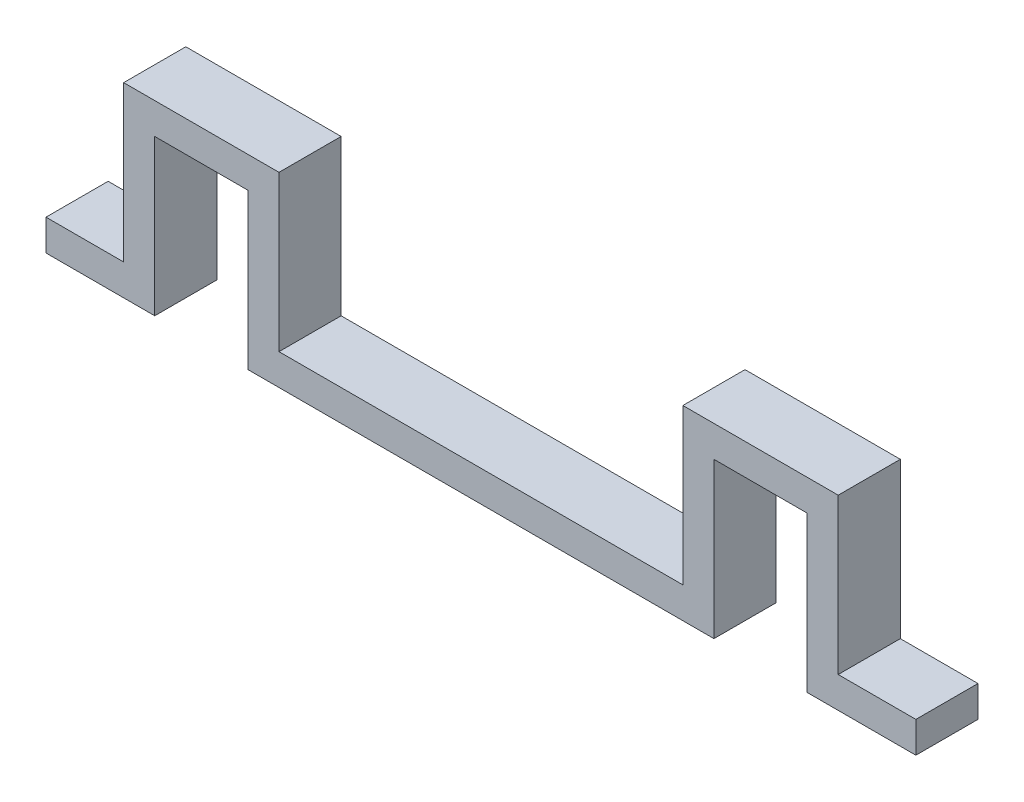
ISO-10303-21;
HEADER;
FILE_DESCRIPTION(('STEP AP214'),'2;1');
FILE_NAME('part.step','',(''),(''),'','','');
FILE_SCHEMA(('AUTOMOTIVE_DESIGN { 1 0 10303 214 1 1 1 1 }'));
ENDSEC;
DATA;
#1=APPLICATION_CONTEXT('core data for automotive mechanical design processes');
#2=APPLICATION_PROTOCOL_DEFINITION('international standard','automotive_design',2000,#1);
#3=PRODUCT_CONTEXT('',#1,'mechanical');
#4=PRODUCT('Part','Part','',(#3));
#5=PRODUCT_RELATED_PRODUCT_CATEGORY('part','',(#4));
#6=PRODUCT_DEFINITION_FORMATION('','',#4);
#7=PRODUCT_DEFINITION_CONTEXT('part definition',#1,'design');
#8=PRODUCT_DEFINITION('design','',#6,#7);
#9=PRODUCT_DEFINITION_SHAPE('','',#8);
#10=(LENGTH_UNIT() NAMED_UNIT(*) SI_UNIT(.MILLI.,.METRE.));
#11=(NAMED_UNIT(*) PLANE_ANGLE_UNIT() SI_UNIT($,.RADIAN.));
#12=(NAMED_UNIT(*) SI_UNIT($,.STERADIAN.) SOLID_ANGLE_UNIT());
#13=UNCERTAINTY_MEASURE_WITH_UNIT(LENGTH_MEASURE(1.E-05),#10,'distance_accuracy_value','');
#14=(GEOMETRIC_REPRESENTATION_CONTEXT(3) GLOBAL_UNCERTAINTY_ASSIGNED_CONTEXT((#13)) GLOBAL_UNIT_ASSIGNED_CONTEXT((#10,
#11,#12)) REPRESENTATION_CONTEXT('',''));
#15=CARTESIAN_POINT('',(0.,0.,0.));
#16=DIRECTION('',(0.,0.,1.));
#17=DIRECTION('',(1.,0.,0.));
#18=AXIS2_PLACEMENT_3D('',#15,#16,#17);
#19=CARTESIAN_POINT('',(-182.199442144108,-97.9005965952621,10.));
#20=DIRECTION('',(1.,0.,0.));
#21=DIRECTION('',(0.,0.,-1.));
#22=AXIS2_PLACEMENT_3D('',#19,#20,#21);
#23=PLANE('',#22);
#24=DIRECTION('',(0.,-1.,0.));
#25=VECTOR('',#24,1.);
#26=CARTESIAN_POINT('',(-182.199442144108,-97.9005965952621,0.));
#27=LINE('',#26,#25);
#28=CARTESIAN_POINT('',(-182.199442144108,-97.9005965952621,0.));
#29=VERTEX_POINT('',#28);
#30=CARTESIAN_POINT('',(-182.199442144108,-102.900596595262,0.));
#31=VERTEX_POINT('',#30);
#32=EDGE_CURVE('E216',#29,#31,#27,.T.);
#33=ORIENTED_EDGE('',*,*,#32,.T.);
#34=DIRECTION('',(0.,0.,-1.));
#35=VECTOR('',#34,1.);
#36=CARTESIAN_POINT('',(-182.199442144108,-102.900596595262,10.));
#37=LINE('',#36,#35);
#38=CARTESIAN_POINT('',(-182.199442144108,-102.900596595262,10.));
#39=VERTEX_POINT('',#38);
#40=EDGE_CURVE('E11',#39,#31,#37,.T.);
#41=ORIENTED_EDGE('',*,*,#40,.F.);
#42=DIRECTION('',(0.,-1.,0.));
#43=VECTOR('',#42,1.);
#44=CARTESIAN_POINT('',(-182.199442144108,-97.9005965952621,10.));
#45=LINE('',#44,#43);
#46=CARTESIAN_POINT('',(-182.199442144108,-97.9005965952621,10.));
#47=VERTEX_POINT('',#46);
#48=EDGE_CURVE('E274',#47,#39,#45,.T.);
#49=ORIENTED_EDGE('',*,*,#48,.F.);
#50=DIRECTION('',(0.,0.,-1.));
#51=VECTOR('',#50,1.);
#52=CARTESIAN_POINT('',(-182.199442144108,-97.9005965952621,10.));
#53=LINE('',#52,#51);
#54=EDGE_CURVE('E212',#47,#29,#53,.T.);
#55=ORIENTED_EDGE('',*,*,#54,.T.);
#56=EDGE_LOOP('',(#33,#41,#49,#55));
#57=FACE_BOUND('',#56,.T.);
#58=ADVANCED_FACE('F43',(#57),#23,.F.);
#59=CARTESIAN_POINT('',(-182.199442144108,-102.900596595262,10.));
#60=DIRECTION('',(0.,1.,0.));
#61=DIRECTION('',(0.,0.,1.));
#62=AXIS2_PLACEMENT_3D('',#59,#60,#61);
#63=PLANE('',#62);
#64=DIRECTION('',(1.,0.,0.));
#65=VECTOR('',#64,1.);
#66=CARTESIAN_POINT('',(-182.199442144108,-102.900596595262,0.));
#67=LINE('',#66,#65);
#68=CARTESIAN_POINT('',(-164.699442144108,-102.900596595262,0.));
#69=VERTEX_POINT('',#68);
#70=EDGE_CURVE('E220',#31,#69,#67,.T.);
#71=ORIENTED_EDGE('',*,*,#70,.T.);
#72=DIRECTION('',(0.,0.,-1.));
#73=VECTOR('',#72,1.);
#74=CARTESIAN_POINT('',(-164.699442144108,-102.900596595262,10.));
#75=LINE('',#74,#73);
#76=CARTESIAN_POINT('',(-164.699442144108,-102.900596595262,10.));
#77=VERTEX_POINT('',#76);
#78=EDGE_CURVE('E52',#77,#69,#75,.T.);
#79=ORIENTED_EDGE('',*,*,#78,.F.);
#80=DIRECTION('',(1.,0.,0.));
#81=VECTOR('',#80,1.);
#82=CARTESIAN_POINT('',(-182.199442144108,-102.900596595262,10.));
#83=LINE('',#82,#81);
#84=EDGE_CURVE('E139',#39,#77,#83,.T.);
#85=ORIENTED_EDGE('',*,*,#84,.F.);
#86=ORIENTED_EDGE('',*,*,#40,.T.);
#87=EDGE_LOOP('',(#71,#79,#85,#86));
#88=FACE_BOUND('',#87,.T.);
#89=ADVANCED_FACE('F424',(#88),#63,.F.);
#90=CARTESIAN_POINT('',(-164.699442144108,-102.900596595262,10.));
#91=DIRECTION('',(-1.,0.,0.));
#92=DIRECTION('',(0.,0.,1.));
#93=AXIS2_PLACEMENT_3D('',#90,#91,#92);
#94=PLANE('',#93);
#95=DIRECTION('',(0.,1.,0.));
#96=VECTOR('',#95,1.);
#97=CARTESIAN_POINT('',(-164.699442144108,-102.900596595262,0.));
#98=LINE('',#97,#96);
#99=CARTESIAN_POINT('',(-164.699442144108,-77.9005965952621,0.));
#100=VERTEX_POINT('',#99);
#101=EDGE_CURVE('E223',#69,#100,#98,.T.);
#102=ORIENTED_EDGE('',*,*,#101,.T.);
#103=DIRECTION('',(0.,0.,-1.));
#104=VECTOR('',#103,1.);
#105=CARTESIAN_POINT('',(-164.699442144108,-77.9005965952621,10.));
#106=LINE('',#105,#104);
#107=CARTESIAN_POINT('',(-164.699442144108,-77.9005965952621,10.));
#108=VERTEX_POINT('',#107);
#109=EDGE_CURVE('E333',#108,#100,#106,.T.);
#110=ORIENTED_EDGE('',*,*,#109,.F.);
#111=DIRECTION('',(0.,1.,0.));
#112=VECTOR('',#111,1.);
#113=CARTESIAN_POINT('',(-164.699442144108,-102.900596595262,10.));
#114=LINE('',#113,#112);
#115=EDGE_CURVE('E343',#77,#108,#114,.T.);
#116=ORIENTED_EDGE('',*,*,#115,.F.);
#117=ORIENTED_EDGE('',*,*,#78,.T.);
#118=EDGE_LOOP('',(#102,#110,#116,#117));
#119=FACE_BOUND('',#118,.T.);
#120=ADVANCED_FACE('F341',(#119),#94,.F.);
#121=CARTESIAN_POINT('',(-164.699442144108,-77.9005965952621,10.));
#122=DIRECTION('',(0.,1.,0.));
#123=DIRECTION('',(0.,0.,1.));
#124=AXIS2_PLACEMENT_3D('',#121,#122,#123);
#125=PLANE('',#124);
#126=DIRECTION('',(1.,0.,0.));
#127=VECTOR('',#126,1.);
#128=CARTESIAN_POINT('',(-164.699442144108,-77.9005965952621,0.));
#129=LINE('',#128,#127);
#130=CARTESIAN_POINT('',(-149.699442144108,-77.9005965952621,0.));
#131=VERTEX_POINT('',#130);
#132=EDGE_CURVE('E226',#100,#131,#129,.T.);
#133=ORIENTED_EDGE('',*,*,#132,.T.);
#134=DIRECTION('',(0.,0.,-1.));
#135=VECTOR('',#134,1.);
#136=CARTESIAN_POINT('',(-149.699442144108,-77.9005965952621,10.));
#137=LINE('',#136,#135);
#138=CARTESIAN_POINT('',(-149.699442144108,-77.9005965952621,10.));
#139=VERTEX_POINT('',#138);
#140=EDGE_CURVE('E329',#139,#131,#137,.T.);
#141=ORIENTED_EDGE('',*,*,#140,.F.);
#142=DIRECTION('',(1.,0.,0.));
#143=VECTOR('',#142,1.);
#144=CARTESIAN_POINT('',(-164.699442144108,-77.9005965952621,10.));
#145=LINE('',#144,#143);
#146=EDGE_CURVE('E362',#108,#139,#145,.T.);
#147=ORIENTED_EDGE('',*,*,#146,.F.);
#148=ORIENTED_EDGE('',*,*,#109,.T.);
#149=EDGE_LOOP('',(#133,#141,#147,#148));
#150=FACE_BOUND('',#149,.T.);
#151=ADVANCED_FACE('F352',(#150),#125,.F.);
#152=CARTESIAN_POINT('',(-149.699442144108,-77.9005965952621,10.));
#153=DIRECTION('',(1.,0.,0.));
#154=DIRECTION('',(0.,0.,-1.));
#155=AXIS2_PLACEMENT_3D('',#152,#153,#154);
#156=PLANE('',#155);
#157=DIRECTION('',(0.,-1.,0.));
#158=VECTOR('',#157,1.);
#159=CARTESIAN_POINT('',(-149.699442144108,-77.9005965952621,0.));
#160=LINE('',#159,#158);
#161=CARTESIAN_POINT('',(-149.699442144108,-102.900596595262,0.));
#162=VERTEX_POINT('',#161);
#163=EDGE_CURVE('E229',#131,#162,#160,.T.);
#164=ORIENTED_EDGE('',*,*,#163,.T.);
#165=DIRECTION('',(0.,0.,-1.));
#166=VECTOR('',#165,1.);
#167=CARTESIAN_POINT('',(-149.699442144108,-102.900596595262,10.));
#168=LINE('',#167,#166);
#169=CARTESIAN_POINT('',(-149.699442144108,-102.900596595262,10.));
#170=VERTEX_POINT('',#169);
#171=EDGE_CURVE('E325',#170,#162,#168,.T.);
#172=ORIENTED_EDGE('',*,*,#171,.F.);
#173=DIRECTION('',(0.,-1.,0.));
#174=VECTOR('',#173,1.);
#175=CARTESIAN_POINT('',(-149.699442144108,-77.9005965952621,10.));
#176=LINE('',#175,#174);
#177=EDGE_CURVE('E358',#139,#170,#176,.T.);
#178=ORIENTED_EDGE('',*,*,#177,.F.);
#179=ORIENTED_EDGE('',*,*,#140,.T.);
#180=EDGE_LOOP('',(#164,#172,#178,#179));
#181=FACE_BOUND('',#180,.T.);
#182=ADVANCED_FACE('F356',(#181),#156,.F.);
#183=CARTESIAN_POINT('',(-149.699442144108,-102.900596595262,10.));
#184=DIRECTION('',(0.,1.,0.));
#185=DIRECTION('',(0.,0.,1.));
#186=AXIS2_PLACEMENT_3D('',#183,#184,#185);
#187=PLANE('',#186);
#188=DIRECTION('',(1.,0.,0.));
#189=VECTOR('',#188,1.);
#190=CARTESIAN_POINT('',(-149.699442144108,-102.900596595262,0.));
#191=LINE('',#190,#189);
#192=CARTESIAN_POINT('',(-74.6994421441076,-102.900596595262,0.));
#193=VERTEX_POINT('',#192);
#194=EDGE_CURVE('E232',#162,#193,#191,.T.);
#195=ORIENTED_EDGE('',*,*,#194,.T.);
#196=DIRECTION('',(0.,0.,-1.));
#197=VECTOR('',#196,1.);
#198=CARTESIAN_POINT('',(-74.6994421441076,-102.900596595262,10.));
#199=LINE('',#198,#197);
#200=CARTESIAN_POINT('',(-74.6994421441076,-102.900596595262,10.));
#201=VERTEX_POINT('',#200);
#202=EDGE_CURVE('E321',#201,#193,#199,.T.);
#203=ORIENTED_EDGE('',*,*,#202,.F.);
#204=DIRECTION('',(1.,0.,0.));
#205=VECTOR('',#204,1.);
#206=CARTESIAN_POINT('',(-149.699442144108,-102.900596595262,10.));
#207=LINE('',#206,#205);
#208=EDGE_CURVE('E361',#170,#201,#207,.T.);
#209=ORIENTED_EDGE('',*,*,#208,.F.);
#210=ORIENTED_EDGE('',*,*,#171,.T.);
#211=EDGE_LOOP('',(#195,#203,#209,#210));
#212=FACE_BOUND('',#211,.T.);
#213=ADVANCED_FACE('F437',(#212),#187,.F.);
#214=CARTESIAN_POINT('',(-74.6994421441076,-102.900596595262,10.));
#215=DIRECTION('',(-1.,0.,0.));
#216=DIRECTION('',(0.,-1.,0.));
#217=AXIS2_PLACEMENT_3D('',#214,#215,#216);
#218=PLANE('',#217);
#219=DIRECTION('',(0.,1.,0.));
#220=VECTOR('',#219,1.);
#221=CARTESIAN_POINT('',(-74.6994421441076,-102.900596595262,0.));
#222=LINE('',#221,#220);
#223=CARTESIAN_POINT('',(-74.6994421441076,-77.9005965952621,0.));
#224=VERTEX_POINT('',#223);
#225=EDGE_CURVE('E235',#193,#224,#222,.T.);
#226=ORIENTED_EDGE('',*,*,#225,.T.);
#227=DIRECTION('',(0.,0.,-1.));
#228=VECTOR('',#227,1.);
#229=CARTESIAN_POINT('',(-74.6994421441076,-77.9005965952621,10.));
#230=LINE('',#229,#228);
#231=CARTESIAN_POINT('',(-74.6994421441076,-77.9005965952621,10.));
#232=VERTEX_POINT('',#231);
#233=EDGE_CURVE('E317',#232,#224,#230,.T.);
#234=ORIENTED_EDGE('',*,*,#233,.F.);
#235=DIRECTION('',(0.,1.,0.));
#236=VECTOR('',#235,1.);
#237=CARTESIAN_POINT('',(-74.6994421441076,-102.900596595262,10.));
#238=LINE('',#237,#236);
#239=EDGE_CURVE('E366',#201,#232,#238,.T.);
#240=ORIENTED_EDGE('',*,*,#239,.F.);
#241=ORIENTED_EDGE('',*,*,#202,.T.);
#242=EDGE_LOOP('',(#226,#234,#240,#241));
#243=FACE_BOUND('',#242,.T.);
#244=ADVANCED_FACE('F440',(#243),#218,.F.);
#245=CARTESIAN_POINT('',(-74.6994421441076,-77.9005965952621,10.));
#246=DIRECTION('',(0.,1.,0.));
#247=DIRECTION('',(0.,0.,1.));
#248=AXIS2_PLACEMENT_3D('',#245,#246,#247);
#249=PLANE('',#248);
#250=DIRECTION('',(1.,0.,0.));
#251=VECTOR('',#250,1.);
#252=CARTESIAN_POINT('',(-74.6994421441076,-77.9005965952621,0.));
#253=LINE('',#252,#251);
#254=CARTESIAN_POINT('',(-59.6994421441076,-77.9005965952621,0.));
#255=VERTEX_POINT('',#254);
#256=EDGE_CURVE('E238',#224,#255,#253,.T.);
#257=ORIENTED_EDGE('',*,*,#256,.T.);
#258=DIRECTION('',(0.,0.,-1.));
#259=VECTOR('',#258,1.);
#260=CARTESIAN_POINT('',(-59.6994421441076,-77.9005965952621,10.));
#261=LINE('',#260,#259);
#262=CARTESIAN_POINT('',(-59.6994421441076,-77.9005965952621,10.));
#263=VERTEX_POINT('',#262);
#264=EDGE_CURVE('E313',#263,#255,#261,.T.);
#265=ORIENTED_EDGE('',*,*,#264,.F.);
#266=DIRECTION('',(1.,0.,0.));
#267=VECTOR('',#266,1.);
#268=CARTESIAN_POINT('',(-74.6994421441076,-77.9005965952621,10.));
#269=LINE('',#268,#267);
#270=EDGE_CURVE('E373',#232,#263,#269,.T.);
#271=ORIENTED_EDGE('',*,*,#270,.F.);
#272=ORIENTED_EDGE('',*,*,#233,.T.);
#273=EDGE_LOOP('',(#257,#265,#271,#272));
#274=FACE_BOUND('',#273,.T.);
#275=ADVANCED_FACE('F444',(#274),#249,.F.);
#276=CARTESIAN_POINT('',(-59.6994421441076,-77.9005965952621,10.));
#277=DIRECTION('',(1.,0.,0.));
#278=DIRECTION('',(0.,1.,0.));
#279=AXIS2_PLACEMENT_3D('',#276,#277,#278);
#280=PLANE('',#279);
#281=DIRECTION('',(0.,-1.,0.));
#282=VECTOR('',#281,1.);
#283=CARTESIAN_POINT('',(-59.6994421441076,-77.9005965952621,0.));
#284=LINE('',#283,#282);
#285=CARTESIAN_POINT('',(-59.6994421441076,-102.900596595262,0.));
#286=VERTEX_POINT('',#285);
#287=EDGE_CURVE('E241',#255,#286,#284,.T.);
#288=ORIENTED_EDGE('',*,*,#287,.T.);
#289=DIRECTION('',(0.,0.,-1.));
#290=VECTOR('',#289,1.);
#291=CARTESIAN_POINT('',(-59.6994421441076,-102.900596595262,10.));
#292=LINE('',#291,#290);
#293=CARTESIAN_POINT('',(-59.6994421441076,-102.900596595262,10.));
#294=VERTEX_POINT('',#293);
#295=EDGE_CURVE('E309',#294,#286,#292,.T.);
#296=ORIENTED_EDGE('',*,*,#295,.F.);
#297=DIRECTION('',(0.,-1.,0.));
#298=VECTOR('',#297,1.);
#299=CARTESIAN_POINT('',(-59.6994421441076,-77.9005965952621,10.));
#300=LINE('',#299,#298);
#301=EDGE_CURVE('E376',#263,#294,#300,.T.);
#302=ORIENTED_EDGE('',*,*,#301,.F.);
#303=ORIENTED_EDGE('',*,*,#264,.T.);
#304=EDGE_LOOP('',(#288,#296,#302,#303));
#305=FACE_BOUND('',#304,.T.);
#306=ADVANCED_FACE('F448',(#305),#280,.F.);
#307=CARTESIAN_POINT('',(-59.6994421441076,-102.900596595262,10.));
#308=DIRECTION('',(0.,1.,0.));
#309=DIRECTION('',(0.,0.,1.));
#310=AXIS2_PLACEMENT_3D('',#307,#308,#309);
#311=PLANE('',#310);
#312=DIRECTION('',(1.,0.,0.));
#313=VECTOR('',#312,1.);
#314=CARTESIAN_POINT('',(-59.6994421441076,-102.900596595262,0.));
#315=LINE('',#314,#313);
#316=CARTESIAN_POINT('',(-42.1994421441076,-102.900596595262,0.));
#317=VERTEX_POINT('',#316);
#318=EDGE_CURVE('E244',#286,#317,#315,.T.);
#319=ORIENTED_EDGE('',*,*,#318,.T.);
#320=DIRECTION('',(0.,0.,-1.));
#321=VECTOR('',#320,1.);
#322=CARTESIAN_POINT('',(-42.1994421441076,-102.900596595262,10.));
#323=LINE('',#322,#321);
#324=CARTESIAN_POINT('',(-42.1994421441076,-102.900596595262,10.));
#325=VERTEX_POINT('',#324);
#326=EDGE_CURVE('E305',#325,#317,#323,.T.);
#327=ORIENTED_EDGE('',*,*,#326,.F.);
#328=DIRECTION('',(1.,0.,0.));
#329=VECTOR('',#328,1.);
#330=CARTESIAN_POINT('',(-59.6994421441076,-102.900596595262,10.));
#331=LINE('',#330,#329);
#332=EDGE_CURVE('E379',#294,#325,#331,.T.);
#333=ORIENTED_EDGE('',*,*,#332,.F.);
#334=ORIENTED_EDGE('',*,*,#295,.T.);
#335=EDGE_LOOP('',(#319,#327,#333,#334));
#336=FACE_BOUND('',#335,.T.);
#337=ADVANCED_FACE('F452',(#336),#311,.F.);
#338=CARTESIAN_POINT('',(-42.1994421441076,-97.9005965952621,10.));
#339=DIRECTION('',(-1.,0.,0.));
#340=DIRECTION('',(0.,0.,1.));
#341=AXIS2_PLACEMENT_3D('',#338,#339,#340);
#342=PLANE('',#341);
#343=DIRECTION('',(0.,1.,0.));
#344=VECTOR('',#343,1.);
#345=CARTESIAN_POINT('',(-42.1994421441076,-97.9005965952621,0.));
#346=LINE('',#345,#344);
#347=CARTESIAN_POINT('',(-42.1994421441076,-97.9005965952621,0.));
#348=VERTEX_POINT('',#347);
#349=EDGE_CURVE('E247',#317,#348,#346,.T.);
#350=ORIENTED_EDGE('',*,*,#349,.T.);
#351=DIRECTION('',(0.,0.,-1.));
#352=VECTOR('',#351,1.);
#353=CARTESIAN_POINT('',(-42.1994421441076,-97.9005965952621,10.));
#354=LINE('',#353,#352);
#355=CARTESIAN_POINT('',(-42.1994421441076,-97.9005965952621,10.));
#356=VERTEX_POINT('',#355);
#357=EDGE_CURVE('E301',#356,#348,#354,.T.);
#358=ORIENTED_EDGE('',*,*,#357,.F.);
#359=DIRECTION('',(0.,1.,0.));
#360=VECTOR('',#359,1.);
#361=CARTESIAN_POINT('',(-42.1994421441076,-97.9005965952621,10.));
#362=LINE('',#361,#360);
#363=EDGE_CURVE('E382',#325,#356,#362,.T.);
#364=ORIENTED_EDGE('',*,*,#363,.F.);
#365=ORIENTED_EDGE('',*,*,#326,.T.);
#366=EDGE_LOOP('',(#350,#358,#364,#365));
#367=FACE_BOUND('',#366,.T.);
#368=ADVANCED_FACE('F456',(#367),#342,.F.);
#369=CARTESIAN_POINT('',(-54.6994421441076,-97.9005965952621,10.));
#370=DIRECTION('',(0.,-1.,0.));
#371=DIRECTION('',(0.,0.,-1.));
#372=AXIS2_PLACEMENT_3D('',#369,#370,#371);
#373=PLANE('',#372);
#374=DIRECTION('',(-1.,0.,0.));
#375=VECTOR('',#374,1.);
#376=CARTESIAN_POINT('',(-54.6994421441076,-97.9005965952621,0.));
#377=LINE('',#376,#375);
#378=CARTESIAN_POINT('',(-54.6994421441076,-97.9005965952621,0.));
#379=VERTEX_POINT('',#378);
#380=EDGE_CURVE('E250',#348,#379,#377,.T.);
#381=ORIENTED_EDGE('',*,*,#380,.T.);
#382=DIRECTION('',(0.,0.,-1.));
#383=VECTOR('',#382,1.);
#384=CARTESIAN_POINT('',(-54.6994421441076,-97.9005965952621,10.));
#385=LINE('',#384,#383);
#386=CARTESIAN_POINT('',(-54.6994421441076,-97.9005965952621,10.));
#387=VERTEX_POINT('',#386);
#388=EDGE_CURVE('E297',#387,#379,#385,.T.);
#389=ORIENTED_EDGE('',*,*,#388,.F.);
#390=DIRECTION('',(-1.,0.,0.));
#391=VECTOR('',#390,1.);
#392=CARTESIAN_POINT('',(-54.6994421441076,-97.9005965952621,10.));
#393=LINE('',#392,#391);
#394=EDGE_CURVE('E385',#356,#387,#393,.T.);
#395=ORIENTED_EDGE('',*,*,#394,.F.);
#396=ORIENTED_EDGE('',*,*,#357,.T.);
#397=EDGE_LOOP('',(#381,#389,#395,#396));
#398=FACE_BOUND('',#397,.T.);
#399=ADVANCED_FACE('F460',(#398),#373,.F.);
#400=CARTESIAN_POINT('',(-54.6994421441076,-72.9005965952621,10.));
#401=DIRECTION('',(-1.,0.,0.));
#402=DIRECTION('',(0.,0.,1.));
#403=AXIS2_PLACEMENT_3D('',#400,#401,#402);
#404=PLANE('',#403);
#405=DIRECTION('',(0.,1.,0.));
#406=VECTOR('',#405,1.);
#407=CARTESIAN_POINT('',(-54.6994421441076,-72.9005965952621,0.));
#408=LINE('',#407,#406);
#409=CARTESIAN_POINT('',(-54.6994421441076,-72.9005965952621,0.));
#410=VERTEX_POINT('',#409);
#411=EDGE_CURVE('E253',#379,#410,#408,.T.);
#412=ORIENTED_EDGE('',*,*,#411,.T.);
#413=DIRECTION('',(0.,0.,-1.));
#414=VECTOR('',#413,1.);
#415=CARTESIAN_POINT('',(-54.6994421441076,-72.9005965952621,10.));
#416=LINE('',#415,#414);
#417=CARTESIAN_POINT('',(-54.6994421441076,-72.9005965952621,10.));
#418=VERTEX_POINT('',#417);
#419=EDGE_CURVE('E293',#418,#410,#416,.T.);
#420=ORIENTED_EDGE('',*,*,#419,.F.);
#421=DIRECTION('',(0.,1.,0.));
#422=VECTOR('',#421,1.);
#423=CARTESIAN_POINT('',(-54.6994421441076,-72.9005965952621,10.));
#424=LINE('',#423,#422);
#425=EDGE_CURVE('E388',#387,#418,#424,.T.);
#426=ORIENTED_EDGE('',*,*,#425,.F.);
#427=ORIENTED_EDGE('',*,*,#388,.T.);
#428=EDGE_LOOP('',(#412,#420,#426,#427));
#429=FACE_BOUND('',#428,.T.);
#430=ADVANCED_FACE('F464',(#429),#404,.F.);
#431=CARTESIAN_POINT('',(-79.6994421441076,-72.9005965952621,10.));
#432=DIRECTION('',(0.,-1.,0.));
#433=DIRECTION('',(0.,0.,-1.));
#434=AXIS2_PLACEMENT_3D('',#431,#432,#433);
#435=PLANE('',#434);
#436=DIRECTION('',(-1.,0.,0.));
#437=VECTOR('',#436,1.);
#438=CARTESIAN_POINT('',(-79.6994421441076,-72.9005965952621,0.));
#439=LINE('',#438,#437);
#440=CARTESIAN_POINT('',(-79.6994421441076,-72.9005965952621,0.));
#441=VERTEX_POINT('',#440);
#442=EDGE_CURVE('E256',#410,#441,#439,.T.);
#443=ORIENTED_EDGE('',*,*,#442,.T.);
#444=DIRECTION('',(0.,0.,-1.));
#445=VECTOR('',#444,1.);
#446=CARTESIAN_POINT('',(-79.6994421441076,-72.9005965952621,10.));
#447=LINE('',#446,#445);
#448=CARTESIAN_POINT('',(-79.6994421441076,-72.9005965952621,10.));
#449=VERTEX_POINT('',#448);
#450=EDGE_CURVE('E289',#449,#441,#447,.T.);
#451=ORIENTED_EDGE('',*,*,#450,.F.);
#452=DIRECTION('',(-1.,0.,0.));
#453=VECTOR('',#452,1.);
#454=CARTESIAN_POINT('',(-79.6994421441076,-72.9005965952621,10.));
#455=LINE('',#454,#453);
#456=EDGE_CURVE('E391',#418,#449,#455,.T.);
#457=ORIENTED_EDGE('',*,*,#456,.F.);
#458=ORIENTED_EDGE('',*,*,#419,.T.);
#459=EDGE_LOOP('',(#443,#451,#457,#458));
#460=FACE_BOUND('',#459,.T.);
#461=ADVANCED_FACE('F468',(#460),#435,.F.);
#462=CARTESIAN_POINT('',(-79.6994421441076,-97.9005965952621,10.));
#463=DIRECTION('',(1.,0.,0.));
#464=DIRECTION('',(0.,1.,0.));
#465=AXIS2_PLACEMENT_3D('',#462,#463,#464);
#466=PLANE('',#465);
#467=DIRECTION('',(0.,-1.,0.));
#468=VECTOR('',#467,1.);
#469=CARTESIAN_POINT('',(-79.6994421441076,-97.9005965952621,0.));
#470=LINE('',#469,#468);
#471=CARTESIAN_POINT('',(-79.6994421441076,-97.9005965952621,0.));
#472=VERTEX_POINT('',#471);
#473=EDGE_CURVE('E259',#441,#472,#470,.T.);
#474=ORIENTED_EDGE('',*,*,#473,.T.);
#475=DIRECTION('',(0.,0.,-1.));
#476=VECTOR('',#475,1.);
#477=CARTESIAN_POINT('',(-79.6994421441076,-97.9005965952621,10.));
#478=LINE('',#477,#476);
#479=CARTESIAN_POINT('',(-79.6994421441076,-97.9005965952621,10.));
#480=VERTEX_POINT('',#479);
#481=EDGE_CURVE('E285',#480,#472,#478,.T.);
#482=ORIENTED_EDGE('',*,*,#481,.F.);
#483=DIRECTION('',(0.,-1.,0.));
#484=VECTOR('',#483,1.);
#485=CARTESIAN_POINT('',(-79.6994421441076,-97.9005965952621,10.));
#486=LINE('',#485,#484);
#487=EDGE_CURVE('E394',#449,#480,#486,.T.);
#488=ORIENTED_EDGE('',*,*,#487,.F.);
#489=ORIENTED_EDGE('',*,*,#450,.T.);
#490=EDGE_LOOP('',(#474,#482,#488,#489));
#491=FACE_BOUND('',#490,.T.);
#492=ADVANCED_FACE('F472',(#491),#466,.F.);
#493=CARTESIAN_POINT('',(-144.699442144108,-97.9005965952621,10.));
#494=DIRECTION('',(0.,-1.,0.));
#495=DIRECTION('',(0.,0.,-1.));
#496=AXIS2_PLACEMENT_3D('',#493,#494,#495);
#497=PLANE('',#496);
#498=DIRECTION('',(-1.,0.,0.));
#499=VECTOR('',#498,1.);
#500=CARTESIAN_POINT('',(-144.699442144108,-97.9005965952621,0.));
#501=LINE('',#500,#499);
#502=CARTESIAN_POINT('',(-144.699442144108,-97.9005965952621,0.));
#503=VERTEX_POINT('',#502);
#504=EDGE_CURVE('E262',#472,#503,#501,.T.);
#505=ORIENTED_EDGE('',*,*,#504,.T.);
#506=DIRECTION('',(0.,0.,-1.));
#507=VECTOR('',#506,1.);
#508=CARTESIAN_POINT('',(-144.699442144108,-97.9005965952621,10.));
#509=LINE('',#508,#507);
#510=CARTESIAN_POINT('',(-144.699442144108,-97.9005965952621,10.));
#511=VERTEX_POINT('',#510);
#512=EDGE_CURVE('E281',#511,#503,#509,.T.);
#513=ORIENTED_EDGE('',*,*,#512,.F.);
#514=DIRECTION('',(-1.,0.,0.));
#515=VECTOR('',#514,1.);
#516=CARTESIAN_POINT('',(-144.699442144108,-97.9005965952621,10.));
#517=LINE('',#516,#515);
#518=EDGE_CURVE('E397',#480,#511,#517,.T.);
#519=ORIENTED_EDGE('',*,*,#518,.F.);
#520=ORIENTED_EDGE('',*,*,#481,.T.);
#521=EDGE_LOOP('',(#505,#513,#519,#520));
#522=FACE_BOUND('',#521,.T.);
#523=ADVANCED_FACE('F405',(#522),#497,.F.);
#524=CARTESIAN_POINT('',(-144.699442144108,-72.9005965952621,10.));
#525=DIRECTION('',(-1.,0.,0.));
#526=DIRECTION('',(0.,0.,1.));
#527=AXIS2_PLACEMENT_3D('',#524,#525,#526);
#528=PLANE('',#527);
#529=DIRECTION('',(0.,1.,0.));
#530=VECTOR('',#529,1.);
#531=CARTESIAN_POINT('',(-144.699442144108,-72.9005965952621,0.));
#532=LINE('',#531,#530);
#533=CARTESIAN_POINT('',(-144.699442144108,-72.9005965952621,0.));
#534=VERTEX_POINT('',#533);
#535=EDGE_CURVE('E265',#503,#534,#532,.T.);
#536=ORIENTED_EDGE('',*,*,#535,.T.);
#537=DIRECTION('',(0.,0.,-1.));
#538=VECTOR('',#537,1.);
#539=CARTESIAN_POINT('',(-144.699442144108,-72.9005965952621,10.));
#540=LINE('',#539,#538);
#541=CARTESIAN_POINT('',(-144.699442144108,-72.9005965952621,10.));
#542=VERTEX_POINT('',#541);
#543=EDGE_CURVE('E205',#542,#534,#540,.T.);
#544=ORIENTED_EDGE('',*,*,#543,.F.);
#545=DIRECTION('',(0.,1.,0.));
#546=VECTOR('',#545,1.);
#547=CARTESIAN_POINT('',(-144.699442144108,-72.9005965952621,10.));
#548=LINE('',#547,#546);
#549=EDGE_CURVE('E194',#511,#542,#548,.T.);
#550=ORIENTED_EDGE('',*,*,#549,.F.);
#551=ORIENTED_EDGE('',*,*,#512,.T.);
#552=EDGE_LOOP('',(#536,#544,#550,#551));
#553=FACE_BOUND('',#552,.T.);
#554=ADVANCED_FACE('F409',(#553),#528,.F.);
#555=CARTESIAN_POINT('',(-169.699442144108,-72.9005965952621,10.));
#556=DIRECTION('',(0.,-1.,0.));
#557=DIRECTION('',(0.,0.,-1.));
#558=AXIS2_PLACEMENT_3D('',#555,#556,#557);
#559=PLANE('',#558);
#560=DIRECTION('',(-1.,0.,0.));
#561=VECTOR('',#560,1.);
#562=CARTESIAN_POINT('',(-169.699442144108,-72.9005965952621,0.));
#563=LINE('',#562,#561);
#564=CARTESIAN_POINT('',(-169.699442144108,-72.9005965952621,0.));
#565=VERTEX_POINT('',#564);
#566=EDGE_CURVE('E203',#534,#565,#563,.T.);
#567=ORIENTED_EDGE('',*,*,#566,.T.);
#568=DIRECTION('',(0.,0.,-1.));
#569=VECTOR('',#568,1.);
#570=CARTESIAN_POINT('',(-169.699442144108,-72.9005965952621,10.));
#571=LINE('',#570,#569);
#572=CARTESIAN_POINT('',(-169.699442144108,-72.9005965952621,10.));
#573=VERTEX_POINT('',#572);
#574=EDGE_CURVE('E200',#573,#565,#571,.T.);
#575=ORIENTED_EDGE('',*,*,#574,.F.);
#576=DIRECTION('',(-1.,0.,0.));
#577=VECTOR('',#576,1.);
#578=CARTESIAN_POINT('',(-169.699442144108,-72.9005965952621,10.));
#579=LINE('',#578,#577);
#580=EDGE_CURVE('E188',#542,#573,#579,.T.);
#581=ORIENTED_EDGE('',*,*,#580,.F.);
#582=ORIENTED_EDGE('',*,*,#543,.T.);
#583=EDGE_LOOP('',(#567,#575,#581,#582));
#584=FACE_BOUND('',#583,.T.);
#585=ADVANCED_FACE('F201',(#584),#559,.F.);
#586=CARTESIAN_POINT('',(-169.699442144108,-97.9005965952621,10.));
#587=DIRECTION('',(1.,0.,0.));
#588=DIRECTION('',(0.,0.,-1.));
#589=AXIS2_PLACEMENT_3D('',#586,#587,#588);
#590=PLANE('',#589);
#591=DIRECTION('',(0.,-1.,0.));
#592=VECTOR('',#591,1.);
#593=CARTESIAN_POINT('',(-169.699442144108,-97.9005965952621,0.));
#594=LINE('',#593,#592);
#595=CARTESIAN_POINT('',(-169.699442144108,-97.9005965952621,0.));
#596=VERTEX_POINT('',#595);
#597=EDGE_CURVE('E125',#565,#596,#594,.T.);
#598=ORIENTED_EDGE('',*,*,#597,.T.);
#599=DIRECTION('',(0.,0.,-1.));
#600=VECTOR('',#599,1.);
#601=CARTESIAN_POINT('',(-169.699442144108,-97.9005965952621,10.));
#602=LINE('',#601,#600);
#603=CARTESIAN_POINT('',(-169.699442144108,-97.9005965952621,10.));
#604=VERTEX_POINT('',#603);
#605=EDGE_CURVE('E206',#604,#596,#602,.T.);
#606=ORIENTED_EDGE('',*,*,#605,.F.);
#607=DIRECTION('',(0.,-1.,0.));
#608=VECTOR('',#607,1.);
#609=CARTESIAN_POINT('',(-169.699442144108,-97.9005965952621,10.));
#610=LINE('',#609,#608);
#611=EDGE_CURVE('E192',#573,#604,#610,.T.);
#612=ORIENTED_EDGE('',*,*,#611,.F.);
#613=ORIENTED_EDGE('',*,*,#574,.T.);
#614=EDGE_LOOP('',(#598,#606,#612,#613));
#615=FACE_BOUND('',#614,.T.);
#616=ADVANCED_FACE('F208',(#615),#590,.F.);
#617=CARTESIAN_POINT('',(-182.199442144108,-97.9005965952621,10.));
#618=DIRECTION('',(0.,-1.,0.));
#619=DIRECTION('',(0.,0.,-1.));
#620=AXIS2_PLACEMENT_3D('',#617,#618,#619);
#621=PLANE('',#620);
#622=DIRECTION('',(-1.,0.,0.));
#623=VECTOR('',#622,1.);
#624=CARTESIAN_POINT('',(-182.199442144108,-97.9005965952621,0.));
#625=LINE('',#624,#623);
#626=EDGE_CURVE('E131',#596,#29,#625,.T.);
#627=ORIENTED_EDGE('',*,*,#626,.T.);
#628=ORIENTED_EDGE('',*,*,#54,.F.);
#629=DIRECTION('',(-1.,0.,0.));
#630=VECTOR('',#629,1.);
#631=CARTESIAN_POINT('',(-182.199442144108,-97.9005965952621,10.));
#632=LINE('',#631,#630);
#633=EDGE_CURVE('E60',#604,#47,#632,.T.);
#634=ORIENTED_EDGE('',*,*,#633,.F.);
#635=ORIENTED_EDGE('',*,*,#605,.T.);
#636=EDGE_LOOP('',(#627,#628,#634,#635));
#637=FACE_BOUND('',#636,.T.);
#638=ADVANCED_FACE('F413',(#637),#621,.F.);
#639=CARTESIAN_POINT('',(0.,0.,10.));
#640=DIRECTION('',(0.,0.,1.));
#641=DIRECTION('',(1.,0.,0.));
#642=AXIS2_PLACEMENT_3D('',#639,#640,#641);
#643=PLANE('',#642);
#644=ORIENTED_EDGE('',*,*,#48,.T.);
#645=ORIENTED_EDGE('',*,*,#84,.T.);
#646=ORIENTED_EDGE('',*,*,#115,.T.);
#647=ORIENTED_EDGE('',*,*,#146,.T.);
#648=ORIENTED_EDGE('',*,*,#177,.T.);
#649=ORIENTED_EDGE('',*,*,#208,.T.);
#650=ORIENTED_EDGE('',*,*,#239,.T.);
#651=ORIENTED_EDGE('',*,*,#270,.T.);
#652=ORIENTED_EDGE('',*,*,#301,.T.);
#653=ORIENTED_EDGE('',*,*,#332,.T.);
#654=ORIENTED_EDGE('',*,*,#363,.T.);
#655=ORIENTED_EDGE('',*,*,#394,.T.);
#656=ORIENTED_EDGE('',*,*,#425,.T.);
#657=ORIENTED_EDGE('',*,*,#456,.T.);
#658=ORIENTED_EDGE('',*,*,#487,.T.);
#659=ORIENTED_EDGE('',*,*,#518,.T.);
#660=ORIENTED_EDGE('',*,*,#549,.T.);
#661=ORIENTED_EDGE('',*,*,#580,.T.);
#662=ORIENTED_EDGE('',*,*,#611,.T.);
#663=ORIENTED_EDGE('',*,*,#633,.T.);
#664=EDGE_LOOP('',(#644,#645,#646,#647,#648,#649,#650,#651,#652,#653,#654,#655,#656,#657,#658,
#659,#660,#661,#662,#663));
#665=FACE_BOUND('',#664,.T.);
#666=ADVANCED_FACE('F190',(#665),#643,.T.);
#667=CARTESIAN_POINT('',(0.,0.,0.));
#668=DIRECTION('',(0.,0.,1.));
#669=DIRECTION('',(1.,0.,0.));
#670=AXIS2_PLACEMENT_3D('',#667,#668,#669);
#671=PLANE('',#670);
#672=ORIENTED_EDGE('',*,*,#32,.F.);
#673=ORIENTED_EDGE('',*,*,#626,.F.);
#674=ORIENTED_EDGE('',*,*,#597,.F.);
#675=ORIENTED_EDGE('',*,*,#566,.F.);
#676=ORIENTED_EDGE('',*,*,#535,.F.);
#677=ORIENTED_EDGE('',*,*,#504,.F.);
#678=ORIENTED_EDGE('',*,*,#473,.F.);
#679=ORIENTED_EDGE('',*,*,#442,.F.);
#680=ORIENTED_EDGE('',*,*,#411,.F.);
#681=ORIENTED_EDGE('',*,*,#380,.F.);
#682=ORIENTED_EDGE('',*,*,#349,.F.);
#683=ORIENTED_EDGE('',*,*,#318,.F.);
#684=ORIENTED_EDGE('',*,*,#287,.F.);
#685=ORIENTED_EDGE('',*,*,#256,.F.);
#686=ORIENTED_EDGE('',*,*,#225,.F.);
#687=ORIENTED_EDGE('',*,*,#194,.F.);
#688=ORIENTED_EDGE('',*,*,#163,.F.);
#689=ORIENTED_EDGE('',*,*,#132,.F.);
#690=ORIENTED_EDGE('',*,*,#101,.F.);
#691=ORIENTED_EDGE('',*,*,#70,.F.);
#692=EDGE_LOOP('',(#672,#673,#674,#675,#676,#677,#678,#679,#680,#681,#682,#683,#684,#685,#686,
#687,#688,#689,#690,#691));
#693=FACE_BOUND('',#692,.T.);
#694=ADVANCED_FACE('F347',(#693),#671,.F.);
#695=CLOSED_SHELL('',(#58,#89,#120,#151,#182,#213,#244,#275,#306,#337,#368,#399,#430,#461,#492,
#523,#554,#585,#616,#638,#666,#694));
#696=MANIFOLD_SOLID_BREP('B2',#695);
#697=ADVANCED_BREP_SHAPE_REPRESENTATION('',(#18,#696),#14);
#698=SHAPE_DEFINITION_REPRESENTATION(#9,#697);
ENDSEC;
END-ISO-10303-21;
